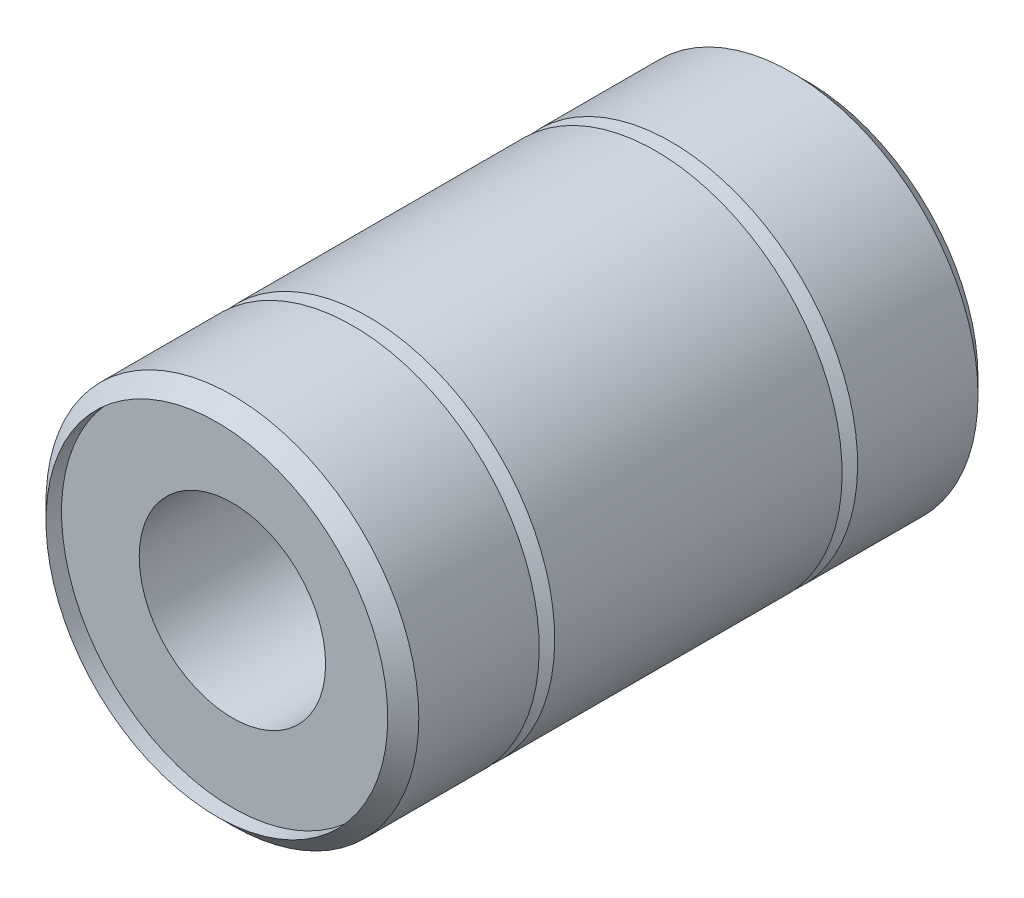
ISO-10303-21;
HEADER;
FILE_DESCRIPTION(('STEP AP214'),'2;1');
FILE_NAME('part.step','',(''),(''),'','','');
FILE_SCHEMA(('AUTOMOTIVE_DESIGN { 1 0 10303 214 1 1 1 1 }'));
ENDSEC;
DATA;
#1=APPLICATION_CONTEXT('core data for automotive mechanical design processes');
#2=APPLICATION_PROTOCOL_DEFINITION('international standard','automotive_design',2000,#1);
#3=PRODUCT_CONTEXT('',#1,'mechanical');
#4=PRODUCT('Part','Part','',(#3));
#5=PRODUCT_RELATED_PRODUCT_CATEGORY('part','',(#4));
#6=PRODUCT_DEFINITION_FORMATION('','',#4);
#7=PRODUCT_DEFINITION_CONTEXT('part definition',#1,'design');
#8=PRODUCT_DEFINITION('design','',#6,#7);
#9=PRODUCT_DEFINITION_SHAPE('','',#8);
#10=(LENGTH_UNIT() NAMED_UNIT(*) SI_UNIT(.MILLI.,.METRE.));
#11=(NAMED_UNIT(*) PLANE_ANGLE_UNIT() SI_UNIT($,.RADIAN.));
#12=(NAMED_UNIT(*) SI_UNIT($,.STERADIAN.) SOLID_ANGLE_UNIT());
#13=UNCERTAINTY_MEASURE_WITH_UNIT(LENGTH_MEASURE(1.E-05),#10,'distance_accuracy_value','');
#14=(GEOMETRIC_REPRESENTATION_CONTEXT(3) GLOBAL_UNCERTAINTY_ASSIGNED_CONTEXT((#13)) GLOBAL_UNIT_ASSIGNED_CONTEXT((#10,
#11,#12)) REPRESENTATION_CONTEXT('',''));
#15=CARTESIAN_POINT('',(0.,0.,0.));
#16=DIRECTION('',(0.,0.,1.));
#17=DIRECTION('',(1.,0.,0.));
#18=AXIS2_PLACEMENT_3D('',#15,#16,#17);
#19=CARTESIAN_POINT('',(0.,0.,9.5));
#20=DIRECTION('',(0.,0.,-1.));
#21=DIRECTION('',(-1.,0.,0.));
#22=AXIS2_PLACEMENT_3D('',#19,#20,#21);
#23=CYLINDRICAL_SURFACE('',#22,6.);
#24=CARTESIAN_POINT('',(0.,0.,4.625));
#25=DIRECTION('',(0.,0.,1.));
#26=DIRECTION('',(0.,-1.,0.));
#27=AXIS2_PLACEMENT_3D('',#24,#25,#26);
#28=CIRCLE('',#27,6.);
#29=CARTESIAN_POINT('',(0.,-6.,4.625));
#30=VERTEX_POINT('',#29);
#31=EDGE_CURVE('E62',#30,#30,#28,.T.);
#32=ORIENTED_EDGE('',*,*,#31,.F.);
#33=EDGE_LOOP('',(#32));
#34=FACE_BOUND('',#33,.T.);
#35=CARTESIAN_POINT('',(0.,0.,-4.625));
#36=DIRECTION('',(0.,0.,1.));
#37=DIRECTION('',(0.,-1.,0.));
#38=AXIS2_PLACEMENT_3D('',#35,#36,#37);
#39=CIRCLE('',#38,6.);
#40=CARTESIAN_POINT('',(0.,-6.,-4.625));
#41=VERTEX_POINT('',#40);
#42=EDGE_CURVE('E73',#41,#41,#39,.T.);
#43=ORIENTED_EDGE('',*,*,#42,.T.);
#44=EDGE_LOOP('',(#43));
#45=FACE_BOUND('',#44,.T.);
#46=ADVANCED_FACE('F31',(#34,#45),#23,.T.);
#47=CARTESIAN_POINT('',(0.,0.,-9.));
#48=DIRECTION('',(0.,0.,1.));
#49=DIRECTION('',(1.,0.,0.));
#50=AXIS2_PLACEMENT_3D('',#47,#48,#49);
#51=CIRCLE('',#50,6.);
#52=CARTESIAN_POINT('',(6.,0.,-9.));
#53=VERTEX_POINT('',#52);
#54=EDGE_CURVE('E10',#53,#53,#51,.T.);
#55=ORIENTED_EDGE('',*,*,#54,.T.);
#56=EDGE_LOOP('',(#55));
#57=FACE_BOUND('',#56,.T.);
#58=CARTESIAN_POINT('',(0.,0.,-5.125));
#59=DIRECTION('',(0.,0.,1.));
#60=DIRECTION('',(0.,-1.,0.));
#61=AXIS2_PLACEMENT_3D('',#58,#59,#60);
#62=CIRCLE('',#61,6.);
#63=CARTESIAN_POINT('',(0.,-6.,-5.125));
#64=VERTEX_POINT('',#63);
#65=EDGE_CURVE('E76',#64,#64,#62,.T.);
#66=ORIENTED_EDGE('',*,*,#65,.F.);
#67=EDGE_LOOP('',(#66));
#68=FACE_BOUND('',#67,.T.);
#69=ADVANCED_FACE('F96',(#57,#68),#23,.T.);
#70=CARTESIAN_POINT('',(0.,0.,9.));
#71=DIRECTION('',(0.,0.,1.));
#72=DIRECTION('',(1.,0.,0.));
#73=AXIS2_PLACEMENT_3D('',#70,#71,#72);
#74=CIRCLE('',#73,6.);
#75=CARTESIAN_POINT('',(6.,0.,9.));
#76=VERTEX_POINT('',#75);
#77=EDGE_CURVE('E39',#76,#76,#74,.F.);
#78=ORIENTED_EDGE('',*,*,#77,.T.);
#79=EDGE_LOOP('',(#78));
#80=FACE_BOUND('',#79,.T.);
#81=CARTESIAN_POINT('',(0.,0.,5.125));
#82=DIRECTION('',(0.,0.,1.));
#83=DIRECTION('',(0.,-1.,0.));
#84=AXIS2_PLACEMENT_3D('',#81,#82,#83);
#85=CIRCLE('',#84,6.);
#86=CARTESIAN_POINT('',(0.,-6.,5.125));
#87=VERTEX_POINT('',#86);
#88=EDGE_CURVE('E67',#87,#87,#85,.T.);
#89=ORIENTED_EDGE('',*,*,#88,.T.);
#90=EDGE_LOOP('',(#89));
#91=FACE_BOUND('',#90,.T.);
#92=ADVANCED_FACE('F99',(#80,#91),#23,.T.);
#93=CARTESIAN_POINT('',(0.,0.,9.5));
#94=DIRECTION('',(0.,0.,-1.));
#95=DIRECTION('',(-1.,0.,0.));
#96=AXIS2_PLACEMENT_3D('',#93,#94,#95);
#97=CYLINDRICAL_SURFACE('',#96,3.);
#98=CARTESIAN_POINT('',(0.,0.,9.));
#99=DIRECTION('',(0.,0.,1.));
#100=DIRECTION('',(1.,0.,0.));
#101=AXIS2_PLACEMENT_3D('',#98,#99,#100);
#102=CIRCLE('',#101,3.);
#103=CARTESIAN_POINT('',(3.,0.,9.));
#104=VERTEX_POINT('',#103);
#105=EDGE_CURVE('E44',#104,#104,#102,.T.);
#106=ORIENTED_EDGE('',*,*,#105,.T.);
#107=EDGE_LOOP('',(#106));
#108=FACE_BOUND('',#107,.T.);
#109=CARTESIAN_POINT('',(0.,0.,-9.));
#110=DIRECTION('',(0.,0.,-1.));
#111=DIRECTION('',(-1.,0.,0.));
#112=AXIS2_PLACEMENT_3D('',#109,#110,#111);
#113=CIRCLE('',#112,3.);
#114=CARTESIAN_POINT('',(-3.,0.,-9.));
#115=VERTEX_POINT('',#114);
#116=EDGE_CURVE('E35',#115,#115,#113,.T.);
#117=ORIENTED_EDGE('',*,*,#116,.T.);
#118=EDGE_LOOP('',(#117));
#119=FACE_BOUND('',#118,.T.);
#120=ADVANCED_FACE('F107',(#108,#119),#97,.F.);
#121=CARTESIAN_POINT('',(0.,0.,-9.));
#122=DIRECTION('',(0.,0.,1.));
#123=DIRECTION('',(1.,0.,0.));
#124=AXIS2_PLACEMENT_3D('',#121,#122,#123);
#125=CONICAL_SURFACE('',#124,6.,0.785398163397453);
#126=CARTESIAN_POINT('',(0.,0.,-9.5));
#127=DIRECTION('',(0.,0.,1.));
#128=DIRECTION('',(1.,0.,0.));
#129=AXIS2_PLACEMENT_3D('',#126,#127,#128);
#130=CIRCLE('',#129,5.50000000000001);
#131=CARTESIAN_POINT('',(5.50000000000001,0.,-9.5));
#132=VERTEX_POINT('',#131);
#133=EDGE_CURVE('E58',#132,#132,#130,.T.);
#134=ORIENTED_EDGE('',*,*,#133,.T.);
#135=EDGE_LOOP('',(#134));
#136=FACE_BOUND('',#135,.T.);
#137=ORIENTED_EDGE('',*,*,#54,.F.);
#138=EDGE_LOOP('',(#137));
#139=FACE_BOUND('',#138,.T.);
#140=ADVANCED_FACE('F112',(#136,#139),#125,.T.);
#141=CARTESIAN_POINT('',(0.,0.,9.5));
#142=DIRECTION('',(0.,0.,-1.));
#143=DIRECTION('',(-1.,0.,0.));
#144=AXIS2_PLACEMENT_3D('',#141,#142,#143);
#145=CONICAL_SURFACE('',#144,5.50000000000001,0.785398163397447);
#146=ORIENTED_EDGE('',*,*,#77,.F.);
#147=EDGE_LOOP('',(#146));
#148=FACE_BOUND('',#147,.T.);
#149=CARTESIAN_POINT('',(0.,0.,9.5));
#150=DIRECTION('',(0.,0.,1.));
#151=DIRECTION('',(1.,0.,0.));
#152=AXIS2_PLACEMENT_3D('',#149,#150,#151);
#153=CIRCLE('',#152,5.50000000000001);
#154=CARTESIAN_POINT('',(5.50000000000001,0.,9.5));
#155=VERTEX_POINT('',#154);
#156=EDGE_CURVE('E52',#155,#155,#153,.T.);
#157=ORIENTED_EDGE('',*,*,#156,.F.);
#158=EDGE_LOOP('',(#157));
#159=FACE_BOUND('',#158,.T.);
#160=ADVANCED_FACE('F33',(#148,#159),#145,.T.);
#161=CARTESIAN_POINT('',(0.,0.,9.));
#162=DIRECTION('',(0.,0.,1.));
#163=DIRECTION('',(1.,0.,0.));
#164=AXIS2_PLACEMENT_3D('',#161,#162,#163);
#165=CYLINDRICAL_SURFACE('',#164,5.50000000000001);
#166=CARTESIAN_POINT('',(0.,0.,9.));
#167=DIRECTION('',(0.,0.,1.));
#168=DIRECTION('',(1.,0.,0.));
#169=AXIS2_PLACEMENT_3D('',#166,#167,#168);
#170=CIRCLE('',#169,5.50000000000001);
#171=CARTESIAN_POINT('',(5.50000000000001,0.,9.));
#172=VERTEX_POINT('',#171);
#173=EDGE_CURVE('E48',#172,#172,#170,.T.);
#174=ORIENTED_EDGE('',*,*,#173,.F.);
#175=EDGE_LOOP('',(#174));
#176=FACE_BOUND('',#175,.T.);
#177=ORIENTED_EDGE('',*,*,#156,.T.);
#178=EDGE_LOOP('',(#177));
#179=FACE_BOUND('',#178,.T.);
#180=ADVANCED_FACE('F138',(#176,#179),#165,.F.);
#181=CARTESIAN_POINT('',(0.,0.,9.));
#182=DIRECTION('',(0.,0.,1.));
#183=DIRECTION('',(1.,0.,0.));
#184=AXIS2_PLACEMENT_3D('',#181,#182,#183);
#185=PLANE('',#184);
#186=ORIENTED_EDGE('',*,*,#105,.F.);
#187=EDGE_LOOP('',(#186));
#188=FACE_BOUND('',#187,.T.);
#189=ORIENTED_EDGE('',*,*,#173,.T.);
#190=EDGE_LOOP('',(#189));
#191=FACE_BOUND('',#190,.T.);
#192=ADVANCED_FACE('F134',(#188,#191),#185,.T.);
#193=CARTESIAN_POINT('',(0.,0.,-9.));
#194=DIRECTION('',(0.,0.,-1.));
#195=DIRECTION('',(-1.,0.,0.));
#196=AXIS2_PLACEMENT_3D('',#193,#194,#195);
#197=CYLINDRICAL_SURFACE('',#196,5.50000000000001);
#198=CARTESIAN_POINT('',(0.,0.,-9.));
#199=DIRECTION('',(0.,0.,1.));
#200=DIRECTION('',(1.,0.,0.));
#201=AXIS2_PLACEMENT_3D('',#198,#199,#200);
#202=CIRCLE('',#201,5.50000000000001);
#203=CARTESIAN_POINT('',(5.50000000000001,0.,-9.));
#204=VERTEX_POINT('',#203);
#205=EDGE_CURVE('E61',#204,#204,#202,.T.);
#206=ORIENTED_EDGE('',*,*,#205,.T.);
#207=EDGE_LOOP('',(#206));
#208=FACE_BOUND('',#207,.T.);
#209=ORIENTED_EDGE('',*,*,#133,.F.);
#210=EDGE_LOOP('',(#209));
#211=FACE_BOUND('',#210,.T.);
#212=ADVANCED_FACE('F130',(#208,#211),#197,.F.);
#213=CARTESIAN_POINT('',(0.,0.,-9.));
#214=DIRECTION('',(0.,0.,-1.));
#215=DIRECTION('',(1.,0.,0.));
#216=AXIS2_PLACEMENT_3D('',#213,#214,#215);
#217=PLANE('',#216);
#218=ORIENTED_EDGE('',*,*,#116,.F.);
#219=EDGE_LOOP('',(#218));
#220=FACE_BOUND('',#219,.T.);
#221=ORIENTED_EDGE('',*,*,#205,.F.);
#222=EDGE_LOOP('',(#221));
#223=FACE_BOUND('',#222,.T.);
#224=ADVANCED_FACE('F124',(#220,#223),#217,.T.);
#225=CARTESIAN_POINT('',(0.,0.,4.875));
#226=DIRECTION('',(0.,0.,-1.));
#227=DIRECTION('',(0.,1.,0.));
#228=AXIS2_PLACEMENT_3D('',#225,#226,#227);
#229=CONICAL_SURFACE('',#228,5.56698729810778,1.0471975511966);
#230=ORIENTED_EDGE('',*,*,#31,.T.);
#231=EDGE_LOOP('',(#230));
#232=FACE_BOUND('',#231,.T.);
#233=CARTESIAN_POINT('',(0.,0.,4.875));
#234=DIRECTION('',(0.,0.,1.));
#235=DIRECTION('',(0.,-1.,0.));
#236=AXIS2_PLACEMENT_3D('',#233,#234,#235);
#237=CIRCLE('',#236,5.56698729810778);
#238=CARTESIAN_POINT('',(0.,-5.56698729810779,4.875));
#239=VERTEX_POINT('',#238);
#240=EDGE_CURVE('E70',#239,#239,#237,.T.);
#241=ORIENTED_EDGE('',*,*,#240,.F.);
#242=EDGE_LOOP('',(#241));
#243=FACE_BOUND('',#242,.T.);
#244=ADVANCED_FACE('F118',(#232,#243),#229,.T.);
#245=CARTESIAN_POINT('',(0.,0.,5.125));
#246=DIRECTION('',(0.,0.,1.));
#247=DIRECTION('',(0.,-1.,0.));
#248=AXIS2_PLACEMENT_3D('',#245,#246,#247);
#249=CONICAL_SURFACE('',#248,6.,1.0471975511966);
#250=ORIENTED_EDGE('',*,*,#240,.T.);
#251=EDGE_LOOP('',(#250));
#252=FACE_BOUND('',#251,.T.);
#253=ORIENTED_EDGE('',*,*,#88,.F.);
#254=EDGE_LOOP('',(#253));
#255=FACE_BOUND('',#254,.T.);
#256=ADVANCED_FACE('F93',(#252,#255),#249,.T.);
#257=CARTESIAN_POINT('',(0.,0.,-4.625));
#258=DIRECTION('',(0.,0.,1.));
#259=DIRECTION('',(0.,-1.,0.));
#260=AXIS2_PLACEMENT_3D('',#257,#258,#259);
#261=CONICAL_SURFACE('',#260,6.,1.0471975511966);
#262=CARTESIAN_POINT('',(0.,0.,-4.875));
#263=DIRECTION('',(0.,0.,1.));
#264=DIRECTION('',(0.,-1.,0.));
#265=AXIS2_PLACEMENT_3D('',#262,#263,#264);
#266=CIRCLE('',#265,5.56698729810778);
#267=CARTESIAN_POINT('',(0.,-5.56698729810778,-4.875));
#268=VERTEX_POINT('',#267);
#269=EDGE_CURVE('E79',#268,#268,#266,.T.);
#270=ORIENTED_EDGE('',*,*,#269,.T.);
#271=EDGE_LOOP('',(#270));
#272=FACE_BOUND('',#271,.T.);
#273=ORIENTED_EDGE('',*,*,#42,.F.);
#274=EDGE_LOOP('',(#273));
#275=FACE_BOUND('',#274,.T.);
#276=ADVANCED_FACE('F83',(#272,#275),#261,.T.);
#277=CARTESIAN_POINT('',(0.,0.,-4.875));
#278=DIRECTION('',(0.,0.,-1.));
#279=DIRECTION('',(0.,1.,0.));
#280=AXIS2_PLACEMENT_3D('',#277,#278,#279);
#281=CONICAL_SURFACE('',#280,5.56698729810778,1.0471975511966);
#282=ORIENTED_EDGE('',*,*,#65,.T.);
#283=EDGE_LOOP('',(#282));
#284=FACE_BOUND('',#283,.T.);
#285=ORIENTED_EDGE('',*,*,#269,.F.);
#286=EDGE_LOOP('',(#285));
#287=FACE_BOUND('',#286,.T.);
#288=ADVANCED_FACE('F86',(#284,#287),#281,.T.);
#289=CLOSED_SHELL('',(#46,#69,#92,#120,#140,#160,#180,#192,#212,#224,#244,#256,#276,#288));
#290=MANIFOLD_SOLID_BREP('B2',#289);
#291=ADVANCED_BREP_SHAPE_REPRESENTATION('',(#18,#290),#14);
#292=SHAPE_DEFINITION_REPRESENTATION(#9,#291);
ENDSEC;
END-ISO-10303-21;
